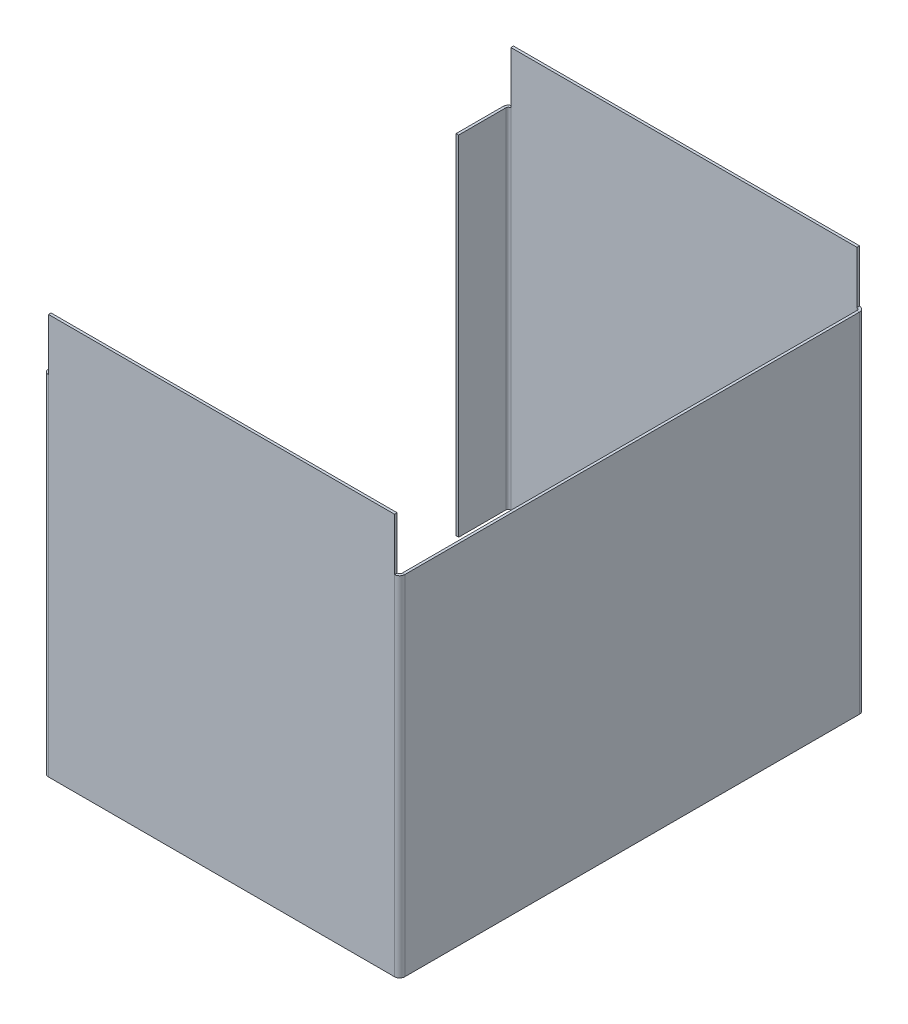
ISO-10303-21;
HEADER;
FILE_DESCRIPTION(('STEP AP214'),'2;1');
FILE_NAME('part.step','',(''),(''),'','','');
FILE_SCHEMA(('AUTOMOTIVE_DESIGN { 1 0 10303 214 1 1 1 1 }'));
ENDSEC;
DATA;
#1=APPLICATION_CONTEXT('core data for automotive mechanical design processes');
#2=APPLICATION_PROTOCOL_DEFINITION('international standard','automotive_design',2000,#1);
#3=PRODUCT_CONTEXT('',#1,'mechanical');
#4=PRODUCT('Part','Part','',(#3));
#5=PRODUCT_RELATED_PRODUCT_CATEGORY('part','',(#4));
#6=PRODUCT_DEFINITION_FORMATION('','',#4);
#7=PRODUCT_DEFINITION_CONTEXT('part definition',#1,'design');
#8=PRODUCT_DEFINITION('design','',#6,#7);
#9=PRODUCT_DEFINITION_SHAPE('','',#8);
#10=(LENGTH_UNIT() NAMED_UNIT(*) SI_UNIT(.MILLI.,.METRE.));
#11=(NAMED_UNIT(*) PLANE_ANGLE_UNIT() SI_UNIT($,.RADIAN.));
#12=(NAMED_UNIT(*) SI_UNIT($,.STERADIAN.) SOLID_ANGLE_UNIT());
#13=UNCERTAINTY_MEASURE_WITH_UNIT(LENGTH_MEASURE(1.E-05),#10,'distance_accuracy_value','');
#14=(GEOMETRIC_REPRESENTATION_CONTEXT(3) GLOBAL_UNCERTAINTY_ASSIGNED_CONTEXT((#13)) GLOBAL_UNIT_ASSIGNED_CONTEXT((#10,
#11,#12)) REPRESENTATION_CONTEXT('',''));
#15=CARTESIAN_POINT('',(0.,0.,0.));
#16=DIRECTION('',(0.,0.,1.));
#17=DIRECTION('',(1.,0.,0.));
#18=AXIS2_PLACEMENT_3D('',#15,#16,#17);
#19=CARTESIAN_POINT('',(0.,100.,-0.736600000000004));
#20=DIRECTION('',(0.,1.,0.));
#21=DIRECTION('',(0.,0.,1.));
#22=AXIS2_PLACEMENT_3D('',#19,#20,#21);
#23=PLANE('',#22);
#24=DIRECTION('',(1.,0.,0.));
#25=VECTOR('',#24,1.);
#26=CARTESIAN_POINT('',(0.,100.,-0.736600000000004));
#27=LINE('',#26,#25);
#28=CARTESIAN_POINT('',(0.,100.,-0.736600000000004));
#29=VERTEX_POINT('',#28);
#30=CARTESIAN_POINT('',(0.7366,100.,-0.736600000000004));
#31=VERTEX_POINT('',#30);
#32=EDGE_CURVE('E13',#29,#31,#27,.T.);
#33=ORIENTED_EDGE('',*,*,#32,.F.);
#34=CARTESIAN_POINT('',(-0.7366,100.,-0.736600000000002));
#35=DIRECTION('',(0.,-1.,0.));
#36=DIRECTION('',(0.,0.,-1.));
#37=AXIS2_PLACEMENT_3D('',#34,#35,#36);
#38=CIRCLE('',#37,0.7366);
#39=CARTESIAN_POINT('',(-0.7366,100.,0.));
#40=VERTEX_POINT('',#39);
#41=EDGE_CURVE('E154',#40,#29,#38,.F.);
#42=ORIENTED_EDGE('',*,*,#41,.F.);
#43=DIRECTION('',(0.,0.,-1.));
#44=VECTOR('',#43,1.);
#45=CARTESIAN_POINT('',(-0.7366,100.,0.736599999999998));
#46=LINE('',#45,#44);
#47=CARTESIAN_POINT('',(-0.7366,100.,0.736599999999998));
#48=VERTEX_POINT('',#47);
#49=EDGE_CURVE('E86',#48,#40,#46,.T.);
#50=ORIENTED_EDGE('',*,*,#49,.F.);
#51=CARTESIAN_POINT('',(-0.7366,100.,-0.736600000000002));
#52=DIRECTION('',(0.,1.,0.));
#53=DIRECTION('',(1.,0.,0.));
#54=AXIS2_PLACEMENT_3D('',#51,#52,#53);
#55=CIRCLE('',#54,1.4732);
#56=EDGE_CURVE('E151',#48,#31,#55,.T.);
#57=ORIENTED_EDGE('',*,*,#56,.T.);
#58=EDGE_LOOP('',(#33,#42,#50,#57));
#59=FACE_BOUND('',#58,.T.);
#60=ADVANCED_FACE('F78',(#59),#23,.T.);
#61=CARTESIAN_POINT('',(-0.7366,100.,0.736599999999998));
#62=DIRECTION('',(0.,1.,0.));
#63=DIRECTION('',(0.,0.,1.));
#64=AXIS2_PLACEMENT_3D('',#61,#62,#63);
#65=PLANE('',#64);
#66=DIRECTION('',(0.,0.,-1.));
#67=VECTOR('',#66,1.);
#68=CARTESIAN_POINT('',(0.,100.,-132.));
#69=LINE('',#68,#67);
#70=CARTESIAN_POINT('',(0.,100.,-131.2634));
#71=VERTEX_POINT('',#70);
#72=EDGE_CURVE('E319',#29,#71,#69,.T.);
#73=ORIENTED_EDGE('',*,*,#72,.F.);
#74=ORIENTED_EDGE('',*,*,#32,.T.);
#75=DIRECTION('',(0.,0.,-1.));
#76=VECTOR('',#75,1.);
#77=CARTESIAN_POINT('',(0.7366,100.,-132.));
#78=LINE('',#77,#76);
#79=CARTESIAN_POINT('',(0.7366,100.,-131.2634));
#80=VERTEX_POINT('',#79);
#81=EDGE_CURVE('E182',#31,#80,#78,.T.);
#82=ORIENTED_EDGE('',*,*,#81,.T.);
#83=DIRECTION('',(-1.,0.,0.));
#84=VECTOR('',#83,1.);
#85=CARTESIAN_POINT('',(0.7366,100.,-131.2634));
#86=LINE('',#85,#84);
#87=EDGE_CURVE('E94',#80,#71,#86,.T.);
#88=ORIENTED_EDGE('',*,*,#87,.T.);
#89=EDGE_LOOP('',(#73,#74,#82,#88));
#90=FACE_BOUND('',#89,.T.);
#91=ADVANCED_FACE('F399',(#90),#65,.T.);
#92=CARTESIAN_POINT('',(-0.7366,0.,0.));
#93=DIRECTION('',(0.,-1.,0.));
#94=DIRECTION('',(0.,0.,-1.));
#95=AXIS2_PLACEMENT_3D('',#92,#93,#94);
#96=PLANE('',#95);
#97=DIRECTION('',(0.,0.,1.));
#98=VECTOR('',#97,1.);
#99=CARTESIAN_POINT('',(-0.7366,0.,0.));
#100=LINE('',#99,#98);
#101=CARTESIAN_POINT('',(-0.7366,0.,0.));
#102=VERTEX_POINT('',#101);
#103=CARTESIAN_POINT('',(-0.7366,0.,0.736599999999998));
#104=VERTEX_POINT('',#103);
#105=EDGE_CURVE('E159',#102,#104,#100,.T.);
#106=ORIENTED_EDGE('',*,*,#105,.F.);
#107=CARTESIAN_POINT('',(-0.7366,0.,-0.736600000000002));
#108=DIRECTION('',(0.,-1.,0.));
#109=DIRECTION('',(0.,0.,-1.));
#110=AXIS2_PLACEMENT_3D('',#107,#108,#109);
#111=CIRCLE('',#110,0.7366);
#112=CARTESIAN_POINT('',(0.,0.,-0.736600000000004));
#113=VERTEX_POINT('',#112);
#114=EDGE_CURVE('E337',#102,#113,#111,.F.);
#115=ORIENTED_EDGE('',*,*,#114,.T.);
#116=DIRECTION('',(-1.,0.,0.));
#117=VECTOR('',#116,1.);
#118=CARTESIAN_POINT('',(0.7366,0.,-0.736600000000004));
#119=LINE('',#118,#117);
#120=CARTESIAN_POINT('',(0.7366,0.,-0.736600000000004));
#121=VERTEX_POINT('',#120);
#122=EDGE_CURVE('E372',#121,#113,#119,.T.);
#123=ORIENTED_EDGE('',*,*,#122,.F.);
#124=CARTESIAN_POINT('',(-0.7366,0.,-0.736600000000002));
#125=DIRECTION('',(0.,1.,0.));
#126=DIRECTION('',(1.,0.,0.));
#127=AXIS2_PLACEMENT_3D('',#124,#125,#126);
#128=CIRCLE('',#127,1.4732);
#129=EDGE_CURVE('E344',#104,#121,#128,.T.);
#130=ORIENTED_EDGE('',*,*,#129,.F.);
#131=EDGE_LOOP('',(#106,#115,#123,#130));
#132=FACE_BOUND('',#131,.T.);
#133=ADVANCED_FACE('F380',(#132),#96,.T.);
#134=CARTESIAN_POINT('',(0.7366,0.,-0.736600000000004));
#135=DIRECTION('',(0.,-1.,0.));
#136=DIRECTION('',(0.,0.,-1.));
#137=AXIS2_PLACEMENT_3D('',#134,#135,#136);
#138=PLANE('',#137);
#139=DIRECTION('',(1.,0.,0.));
#140=VECTOR('',#139,1.);
#141=CARTESIAN_POINT('',(0.,0.,0.));
#142=LINE('',#141,#140);
#143=CARTESIAN_POINT('',(-100.0634,0.,0.));
#144=VERTEX_POINT('',#143);
#145=EDGE_CURVE('E340',#144,#102,#142,.T.);
#146=ORIENTED_EDGE('',*,*,#145,.T.);
#147=ORIENTED_EDGE('',*,*,#105,.T.);
#148=DIRECTION('',(1.,0.,0.));
#149=VECTOR('',#148,1.);
#150=CARTESIAN_POINT('',(0.,0.,0.7366));
#151=LINE('',#150,#149);
#152=CARTESIAN_POINT('',(-100.0634,0.,0.736600000000011));
#153=VERTEX_POINT('',#152);
#154=EDGE_CURVE('E172',#153,#104,#151,.T.);
#155=ORIENTED_EDGE('',*,*,#154,.F.);
#156=DIRECTION('',(0.,0.,1.));
#157=VECTOR('',#156,1.);
#158=CARTESIAN_POINT('',(-100.0634,0.,0.));
#159=LINE('',#158,#157);
#160=EDGE_CURVE('E250',#144,#153,#159,.T.);
#161=ORIENTED_EDGE('',*,*,#160,.F.);
#162=EDGE_LOOP('',(#146,#147,#155,#161));
#163=FACE_BOUND('',#162,.T.);
#164=ADVANCED_FACE('F375',(#163),#138,.T.);
#165=CARTESIAN_POINT('',(-0.7366,100.,-132.));
#166=DIRECTION('',(0.,1.,0.));
#167=DIRECTION('',(0.,0.,1.));
#168=AXIS2_PLACEMENT_3D('',#165,#166,#167);
#169=PLANE('',#168);
#170=DIRECTION('',(0.,0.,-1.));
#171=VECTOR('',#170,1.);
#172=CARTESIAN_POINT('',(-0.7366,100.,-132.));
#173=LINE('',#172,#171);
#174=CARTESIAN_POINT('',(-0.7366,100.,-132.));
#175=VERTEX_POINT('',#174);
#176=CARTESIAN_POINT('',(-0.7366,100.,-132.7366));
#177=VERTEX_POINT('',#176);
#178=EDGE_CURVE('E369',#175,#177,#173,.T.);
#179=ORIENTED_EDGE('',*,*,#178,.F.);
#180=CARTESIAN_POINT('',(-0.7366,100.,-131.2634));
#181=DIRECTION('',(0.,-1.,0.));
#182=DIRECTION('',(0.,0.,-1.));
#183=AXIS2_PLACEMENT_3D('',#180,#181,#182);
#184=CIRCLE('',#183,0.7366);
#185=EDGE_CURVE('E316',#71,#175,#184,.F.);
#186=ORIENTED_EDGE('',*,*,#185,.F.);
#187=ORIENTED_EDGE('',*,*,#87,.F.);
#188=CARTESIAN_POINT('',(-0.7366,100.,-131.2634));
#189=DIRECTION('',(0.,1.,0.));
#190=DIRECTION('',(1.,0.,0.));
#191=AXIS2_PLACEMENT_3D('',#188,#189,#190);
#192=CIRCLE('',#191,1.4732);
#193=EDGE_CURVE('E325',#80,#177,#192,.T.);
#194=ORIENTED_EDGE('',*,*,#193,.T.);
#195=EDGE_LOOP('',(#179,#186,#187,#194));
#196=FACE_BOUND('',#195,.T.);
#197=ADVANCED_FACE('F409',(#196),#169,.T.);
#198=CARTESIAN_POINT('',(0.,0.,-131.2634));
#199=DIRECTION('',(0.,-1.,0.));
#200=DIRECTION('',(0.,0.,-1.));
#201=AXIS2_PLACEMENT_3D('',#198,#199,#200);
#202=PLANE('',#201);
#203=DIRECTION('',(1.,0.,0.));
#204=VECTOR('',#203,1.);
#205=CARTESIAN_POINT('',(0.,0.,-131.2634));
#206=LINE('',#205,#204);
#207=CARTESIAN_POINT('',(0.,0.,-131.2634));
#208=VERTEX_POINT('',#207);
#209=CARTESIAN_POINT('',(0.7366,0.,-131.2634));
#210=VERTEX_POINT('',#209);
#211=EDGE_CURVE('E123',#208,#210,#206,.T.);
#212=ORIENTED_EDGE('',*,*,#211,.F.);
#213=CARTESIAN_POINT('',(-0.7366,0.,-131.2634));
#214=DIRECTION('',(0.,-1.,0.));
#215=DIRECTION('',(0.,0.,-1.));
#216=AXIS2_PLACEMENT_3D('',#213,#214,#215);
#217=CIRCLE('',#216,0.7366);
#218=CARTESIAN_POINT('',(-0.7366,0.,-132.));
#219=VERTEX_POINT('',#218);
#220=EDGE_CURVE('E333',#208,#219,#217,.F.);
#221=ORIENTED_EDGE('',*,*,#220,.T.);
#222=DIRECTION('',(0.,0.,1.));
#223=VECTOR('',#222,1.);
#224=CARTESIAN_POINT('',(-0.7366,0.,-132.7366));
#225=LINE('',#224,#223);
#226=CARTESIAN_POINT('',(-0.7366,0.,-132.7366));
#227=VERTEX_POINT('',#226);
#228=EDGE_CURVE('E130',#227,#219,#225,.T.);
#229=ORIENTED_EDGE('',*,*,#228,.F.);
#230=CARTESIAN_POINT('',(-0.7366,0.,-131.2634));
#231=DIRECTION('',(0.,1.,0.));
#232=DIRECTION('',(1.,0.,0.));
#233=AXIS2_PLACEMENT_3D('',#230,#231,#232);
#234=CIRCLE('',#233,1.4732);
#235=EDGE_CURVE('E320',#210,#227,#234,.T.);
#236=ORIENTED_EDGE('',*,*,#235,.F.);
#237=EDGE_LOOP('',(#212,#221,#229,#236));
#238=FACE_BOUND('',#237,.T.);
#239=ADVANCED_FACE('F412',(#238),#202,.T.);
#240=CARTESIAN_POINT('',(-0.7366,0.,-132.7366));
#241=DIRECTION('',(0.,-1.,0.));
#242=DIRECTION('',(0.,0.,-1.));
#243=AXIS2_PLACEMENT_3D('',#240,#241,#242);
#244=PLANE('',#243);
#245=DIRECTION('',(0.,0.,-1.));
#246=VECTOR('',#245,1.);
#247=CARTESIAN_POINT('',(0.,0.,-132.));
#248=LINE('',#247,#246);
#249=EDGE_CURVE('E335',#113,#208,#248,.T.);
#250=ORIENTED_EDGE('',*,*,#249,.T.);
#251=ORIENTED_EDGE('',*,*,#211,.T.);
#252=DIRECTION('',(0.,0.,-1.));
#253=VECTOR('',#252,1.);
#254=CARTESIAN_POINT('',(0.7366,0.,-132.));
#255=LINE('',#254,#253);
#256=EDGE_CURVE('E346',#121,#210,#255,.T.);
#257=ORIENTED_EDGE('',*,*,#256,.F.);
#258=ORIENTED_EDGE('',*,*,#122,.T.);
#259=EDGE_LOOP('',(#250,#251,#257,#258));
#260=FACE_BOUND('',#259,.T.);
#261=ADVANCED_FACE('F394',(#260),#244,.T.);
#262=CARTESIAN_POINT('',(0.,100.,-132.7366));
#263=DIRECTION('',(0.,0.,1.));
#264=DIRECTION('',(1.,0.,0.));
#265=AXIS2_PLACEMENT_3D('',#262,#263,#264);
#266=PLANE('',#265);
#267=DIRECTION('',(1.,0.,0.));
#268=VECTOR('',#267,1.);
#269=CARTESIAN_POINT('',(0.,0.,-132.7366));
#270=LINE('',#269,#268);
#271=CARTESIAN_POINT('',(-100.0634,0.,-132.7366));
#272=VERTEX_POINT('',#271);
#273=EDGE_CURVE('E313',#227,#272,#270,.F.);
#274=ORIENTED_EDGE('',*,*,#273,.T.);
#275=DIRECTION('',(0.,-1.,0.));
#276=VECTOR('',#275,1.);
#277=CARTESIAN_POINT('',(-100.0634,0.,-132.7366));
#278=LINE('',#277,#276);
#279=CARTESIAN_POINT('',(-100.0634,100.,-132.7366));
#280=VERTEX_POINT('',#279);
#281=EDGE_CURVE('E292',#272,#280,#278,.F.);
#282=ORIENTED_EDGE('',*,*,#281,.T.);
#283=DIRECTION('',(0.,-1.,0.));
#284=VECTOR('',#283,1.);
#285=CARTESIAN_POINT('',(-100.0634,115.,-132.7366));
#286=LINE('',#285,#284);
#287=CARTESIAN_POINT('',(-100.0634,115.,-132.7366));
#288=VERTEX_POINT('',#287);
#289=EDGE_CURVE('E645',#288,#280,#286,.T.);
#290=ORIENTED_EDGE('',*,*,#289,.F.);
#291=DIRECTION('',(-1.,0.,0.));
#292=VECTOR('',#291,1.);
#293=CARTESIAN_POINT('',(-0.7366,115.,-132.7366));
#294=LINE('',#293,#292);
#295=CARTESIAN_POINT('',(-0.7366,115.,-132.7366));
#296=VERTEX_POINT('',#295);
#297=EDGE_CURVE('E558',#296,#288,#294,.T.);
#298=ORIENTED_EDGE('',*,*,#297,.F.);
#299=DIRECTION('',(0.,-1.,0.));
#300=VECTOR('',#299,1.);
#301=CARTESIAN_POINT('',(-0.7366,115.,-132.7366));
#302=LINE('',#301,#300);
#303=EDGE_CURVE('E576',#296,#177,#302,.T.);
#304=ORIENTED_EDGE('',*,*,#303,.T.);
#305=DIRECTION('',(0.,-1.,0.));
#306=VECTOR('',#305,1.);
#307=CARTESIAN_POINT('',(-0.7366,100.,-132.7366));
#308=LINE('',#307,#306);
#309=EDGE_CURVE('E327',#177,#227,#308,.T.);
#310=ORIENTED_EDGE('',*,*,#309,.T.);
#311=EDGE_LOOP('',(#274,#282,#290,#298,#304,#310));
#312=FACE_BOUND('',#311,.T.);
#313=ADVANCED_FACE('F417',(#312),#266,.F.);
#314=CARTESIAN_POINT('',(0.,100.,-132.));
#315=DIRECTION('',(0.,0.,1.));
#316=DIRECTION('',(1.,0.,0.));
#317=AXIS2_PLACEMENT_3D('',#314,#315,#316);
#318=PLANE('',#317);
#319=DIRECTION('',(-1.,0.,0.));
#320=VECTOR('',#319,1.);
#321=CARTESIAN_POINT('',(0.,0.,-132.));
#322=LINE('',#321,#320);
#323=CARTESIAN_POINT('',(-100.0634,0.,-132.));
#324=VERTEX_POINT('',#323);
#325=EDGE_CURVE('E330',#219,#324,#322,.T.);
#326=ORIENTED_EDGE('',*,*,#325,.F.);
#327=DIRECTION('',(0.,-1.,0.));
#328=VECTOR('',#327,1.);
#329=CARTESIAN_POINT('',(-0.7366,100.,-132.));
#330=LINE('',#329,#328);
#331=EDGE_CURVE('E363',#175,#219,#330,.T.);
#332=ORIENTED_EDGE('',*,*,#331,.F.);
#333=DIRECTION('',(0.,-1.,0.));
#334=VECTOR('',#333,1.);
#335=CARTESIAN_POINT('',(-0.7366,115.,-132.));
#336=LINE('',#335,#334);
#337=CARTESIAN_POINT('',(-0.7366,115.,-132.));
#338=VERTEX_POINT('',#337);
#339=EDGE_CURVE('E570',#338,#175,#336,.T.);
#340=ORIENTED_EDGE('',*,*,#339,.F.);
#341=DIRECTION('',(1.,0.,0.));
#342=VECTOR('',#341,1.);
#343=CARTESIAN_POINT('',(-100.0634,115.,-132.));
#344=LINE('',#343,#342);
#345=CARTESIAN_POINT('',(-100.0634,115.,-132.));
#346=VERTEX_POINT('',#345);
#347=EDGE_CURVE('E554',#346,#338,#344,.T.);
#348=ORIENTED_EDGE('',*,*,#347,.F.);
#349=DIRECTION('',(0.,-1.,0.));
#350=VECTOR('',#349,1.);
#351=CARTESIAN_POINT('',(-100.0634,115.,-132.));
#352=LINE('',#351,#350);
#353=CARTESIAN_POINT('',(-100.0634,100.,-132.));
#354=VERTEX_POINT('',#353);
#355=EDGE_CURVE('E566',#346,#354,#352,.T.);
#356=ORIENTED_EDGE('',*,*,#355,.T.);
#357=DIRECTION('',(0.,-1.,0.));
#358=VECTOR('',#357,1.);
#359=CARTESIAN_POINT('',(-100.0634,0.,-132.));
#360=LINE('',#359,#358);
#361=EDGE_CURVE('E305',#324,#354,#360,.F.);
#362=ORIENTED_EDGE('',*,*,#361,.F.);
#363=EDGE_LOOP('',(#326,#332,#340,#348,#356,#362));
#364=FACE_BOUND('',#363,.T.);
#365=ADVANCED_FACE('F420',(#364),#318,.T.);
#366=CARTESIAN_POINT('',(-0.7366,100.,-131.2634));
#367=DIRECTION('',(0.,-1.,0.));
#368=DIRECTION('',(0.,0.,-1.));
#369=AXIS2_PLACEMENT_3D('',#366,#367,#368);
#370=CYLINDRICAL_SURFACE('',#369,0.7366);
#371=ORIENTED_EDGE('',*,*,#220,.F.);
#372=DIRECTION('',(0.,-1.,0.));
#373=VECTOR('',#372,1.);
#374=CARTESIAN_POINT('',(0.,100.,-131.2634));
#375=LINE('',#374,#373);
#376=EDGE_CURVE('E360',#71,#208,#375,.T.);
#377=ORIENTED_EDGE('',*,*,#376,.F.);
#378=ORIENTED_EDGE('',*,*,#185,.T.);
#379=ORIENTED_EDGE('',*,*,#331,.T.);
#380=EDGE_LOOP('',(#371,#377,#378,#379));
#381=FACE_BOUND('',#380,.T.);
#382=ADVANCED_FACE('F424',(#381),#370,.F.);
#383=CARTESIAN_POINT('',(0.,100.,-132.));
#384=DIRECTION('',(-1.,0.,0.));
#385=DIRECTION('',(0.,0.,1.));
#386=AXIS2_PLACEMENT_3D('',#383,#384,#385);
#387=PLANE('',#386);
#388=ORIENTED_EDGE('',*,*,#249,.F.);
#389=DIRECTION('',(0.,-1.,0.));
#390=VECTOR('',#389,1.);
#391=CARTESIAN_POINT('',(0.,100.,-0.736600000000004));
#392=LINE('',#391,#390);
#393=EDGE_CURVE('E357',#29,#113,#392,.T.);
#394=ORIENTED_EDGE('',*,*,#393,.F.);
#395=ORIENTED_EDGE('',*,*,#72,.T.);
#396=ORIENTED_EDGE('',*,*,#376,.T.);
#397=EDGE_LOOP('',(#388,#394,#395,#396));
#398=FACE_BOUND('',#397,.T.);
#399=ADVANCED_FACE('F392',(#398),#387,.T.);
#400=CARTESIAN_POINT('',(-0.7366,100.,-0.736600000000002));
#401=DIRECTION('',(0.,-1.,0.));
#402=DIRECTION('',(0.,0.,-1.));
#403=AXIS2_PLACEMENT_3D('',#400,#401,#402);
#404=CYLINDRICAL_SURFACE('',#403,0.7366);
#405=ORIENTED_EDGE('',*,*,#114,.F.);
#406=DIRECTION('',(0.,-1.,0.));
#407=VECTOR('',#406,1.);
#408=CARTESIAN_POINT('',(-0.7366,100.,0.));
#409=LINE('',#408,#407);
#410=EDGE_CURVE('E176',#40,#102,#409,.T.);
#411=ORIENTED_EDGE('',*,*,#410,.F.);
#412=ORIENTED_EDGE('',*,*,#41,.T.);
#413=ORIENTED_EDGE('',*,*,#393,.T.);
#414=EDGE_LOOP('',(#405,#411,#412,#413));
#415=FACE_BOUND('',#414,.T.);
#416=ADVANCED_FACE('F388',(#415),#404,.F.);
#417=CARTESIAN_POINT('',(0.,100.,0.));
#418=DIRECTION('',(0.,0.,-1.));
#419=DIRECTION('',(-1.,0.,0.));
#420=AXIS2_PLACEMENT_3D('',#417,#418,#419);
#421=PLANE('',#420);
#422=ORIENTED_EDGE('',*,*,#145,.F.);
#423=DIRECTION('',(0.,1.,0.));
#424=VECTOR('',#423,1.);
#425=CARTESIAN_POINT('',(-100.0634,100.,0.));
#426=LINE('',#425,#424);
#427=CARTESIAN_POINT('',(-100.0634,100.,0.));
#428=VERTEX_POINT('',#427);
#429=EDGE_CURVE('E245',#428,#144,#426,.F.);
#430=ORIENTED_EDGE('',*,*,#429,.F.);
#431=DIRECTION('',(0.,-1.,0.));
#432=VECTOR('',#431,1.);
#433=CARTESIAN_POINT('',(-100.0634,115.,0.));
#434=LINE('',#433,#432);
#435=CARTESIAN_POINT('',(-100.0634,115.,0.));
#436=VERTEX_POINT('',#435);
#437=EDGE_CURVE('E193',#436,#428,#434,.T.);
#438=ORIENTED_EDGE('',*,*,#437,.F.);
#439=DIRECTION('',(-1.,0.,0.));
#440=VECTOR('',#439,1.);
#441=CARTESIAN_POINT('',(-0.7366,115.,0.));
#442=LINE('',#441,#440);
#443=CARTESIAN_POINT('',(-0.7366,115.,0.));
#444=VERTEX_POINT('',#443);
#445=EDGE_CURVE('E583',#444,#436,#442,.T.);
#446=ORIENTED_EDGE('',*,*,#445,.F.);
#447=DIRECTION('',(0.,-1.,0.));
#448=VECTOR('',#447,1.);
#449=CARTESIAN_POINT('',(-0.7366,115.,0.));
#450=LINE('',#449,#448);
#451=EDGE_CURVE('E188',#444,#40,#450,.T.);
#452=ORIENTED_EDGE('',*,*,#451,.T.);
#453=ORIENTED_EDGE('',*,*,#410,.T.);
#454=EDGE_LOOP('',(#422,#430,#438,#446,#452,#453));
#455=FACE_BOUND('',#454,.T.);
#456=ADVANCED_FACE('F383',(#455),#421,.T.);
#457=CARTESIAN_POINT('',(0.,100.,0.7366));
#458=DIRECTION('',(0.,0.,-1.));
#459=DIRECTION('',(-1.,0.,0.));
#460=AXIS2_PLACEMENT_3D('',#457,#458,#459);
#461=PLANE('',#460);
#462=ORIENTED_EDGE('',*,*,#154,.T.);
#463=DIRECTION('',(0.,-1.,0.));
#464=VECTOR('',#463,1.);
#465=CARTESIAN_POINT('',(-0.7366,100.,0.736599999999998));
#466=LINE('',#465,#464);
#467=EDGE_CURVE('E164',#48,#104,#466,.T.);
#468=ORIENTED_EDGE('',*,*,#467,.F.);
#469=DIRECTION('',(0.,-1.,0.));
#470=VECTOR('',#469,1.);
#471=CARTESIAN_POINT('',(-0.7366,115.,0.736599999999998));
#472=LINE('',#471,#470);
#473=CARTESIAN_POINT('',(-0.7366,115.,0.736599999999998));
#474=VERTEX_POINT('',#473);
#475=EDGE_CURVE('E168',#474,#48,#472,.T.);
#476=ORIENTED_EDGE('',*,*,#475,.F.);
#477=DIRECTION('',(1.,0.,0.));
#478=VECTOR('',#477,1.);
#479=CARTESIAN_POINT('',(-100.0634,115.,0.736600000000011));
#480=LINE('',#479,#478);
#481=CARTESIAN_POINT('',(-100.0634,115.,0.736600000000011));
#482=VERTEX_POINT('',#481);
#483=EDGE_CURVE('E573',#482,#474,#480,.T.);
#484=ORIENTED_EDGE('',*,*,#483,.F.);
#485=DIRECTION('',(0.,-1.,0.));
#486=VECTOR('',#485,1.);
#487=CARTESIAN_POINT('',(-100.0634,115.,0.736600000000011));
#488=LINE('',#487,#486);
#489=CARTESIAN_POINT('',(-100.0634,100.,0.736600000000011));
#490=VERTEX_POINT('',#489);
#491=EDGE_CURVE('E187',#482,#490,#488,.T.);
#492=ORIENTED_EDGE('',*,*,#491,.T.);
#493=DIRECTION('',(0.,1.,0.));
#494=VECTOR('',#493,1.);
#495=CARTESIAN_POINT('',(-100.0634,100.,0.736600000000011));
#496=LINE('',#495,#494);
#497=EDGE_CURVE('E233',#490,#153,#496,.F.);
#498=ORIENTED_EDGE('',*,*,#497,.T.);
#499=EDGE_LOOP('',(#462,#468,#476,#484,#492,#498));
#500=FACE_BOUND('',#499,.T.);
#501=ADVANCED_FACE('F165',(#500),#461,.F.);
#502=CARTESIAN_POINT('',(-0.7366,100.,-0.736600000000002));
#503=DIRECTION('',(0.,-1.,0.));
#504=DIRECTION('',(0.,0.,-1.));
#505=AXIS2_PLACEMENT_3D('',#502,#503,#504);
#506=CYLINDRICAL_SURFACE('',#505,1.4732);
#507=ORIENTED_EDGE('',*,*,#129,.T.);
#508=DIRECTION('',(0.,-1.,0.));
#509=VECTOR('',#508,1.);
#510=CARTESIAN_POINT('',(0.7366,100.,-0.736600000000004));
#511=LINE('',#510,#509);
#512=EDGE_CURVE('E177',#31,#121,#511,.T.);
#513=ORIENTED_EDGE('',*,*,#512,.F.);
#514=ORIENTED_EDGE('',*,*,#56,.F.);
#515=ORIENTED_EDGE('',*,*,#467,.T.);
#516=EDGE_LOOP('',(#507,#513,#514,#515));
#517=FACE_BOUND('',#516,.T.);
#518=ADVANCED_FACE('F179',(#517),#506,.T.);
#519=CARTESIAN_POINT('',(0.7366,100.,-132.));
#520=DIRECTION('',(-1.,0.,0.));
#521=DIRECTION('',(0.,0.,1.));
#522=AXIS2_PLACEMENT_3D('',#519,#520,#521);
#523=PLANE('',#522);
#524=ORIENTED_EDGE('',*,*,#256,.T.);
#525=DIRECTION('',(0.,-1.,0.));
#526=VECTOR('',#525,1.);
#527=CARTESIAN_POINT('',(0.7366,100.,-131.2634));
#528=LINE('',#527,#526);
#529=EDGE_CURVE('E351',#80,#210,#528,.T.);
#530=ORIENTED_EDGE('',*,*,#529,.F.);
#531=ORIENTED_EDGE('',*,*,#81,.F.);
#532=ORIENTED_EDGE('',*,*,#512,.T.);
#533=EDGE_LOOP('',(#524,#530,#531,#532));
#534=FACE_BOUND('',#533,.T.);
#535=ADVANCED_FACE('F396',(#534),#523,.F.);
#536=CARTESIAN_POINT('',(-0.7366,100.,-131.2634));
#537=DIRECTION('',(0.,-1.,0.));
#538=DIRECTION('',(0.,0.,-1.));
#539=AXIS2_PLACEMENT_3D('',#536,#537,#538);
#540=CYLINDRICAL_SURFACE('',#539,1.4732);
#541=ORIENTED_EDGE('',*,*,#235,.T.);
#542=ORIENTED_EDGE('',*,*,#309,.F.);
#543=ORIENTED_EDGE('',*,*,#193,.F.);
#544=ORIENTED_EDGE('',*,*,#529,.T.);
#545=EDGE_LOOP('',(#541,#542,#543,#544));
#546=FACE_BOUND('',#545,.T.);
#547=ADVANCED_FACE('F441',(#546),#540,.T.);
#548=CARTESIAN_POINT('',(-0.7366,0.,-131.2634));
#549=DIRECTION('',(0.,-1.,0.));
#550=DIRECTION('',(-1.,0.,0.));
#551=AXIS2_PLACEMENT_3D('',#548,#549,#550);
#552=PLANE('',#551);
#553=ORIENTED_EDGE('',*,*,#273,.F.);
#554=ORIENTED_EDGE('',*,*,#228,.T.);
#555=ORIENTED_EDGE('',*,*,#325,.T.);
#556=DIRECTION('',(0.,0.,-1.));
#557=VECTOR('',#556,1.);
#558=CARTESIAN_POINT('',(-100.0634,0.,-132.));
#559=LINE('',#558,#557);
#560=EDGE_CURVE('E299',#324,#272,#559,.T.);
#561=ORIENTED_EDGE('',*,*,#560,.T.);
#562=EDGE_LOOP('',(#553,#554,#555,#561));
#563=FACE_BOUND('',#562,.T.);
#564=ADVANCED_FACE('F444',(#563),#552,.T.);
#565=CARTESIAN_POINT('',(-100.0634,100.,-131.2634));
#566=DIRECTION('',(0.,1.,0.));
#567=DIRECTION('',(0.,0.,1.));
#568=AXIS2_PLACEMENT_3D('',#565,#566,#567);
#569=PLANE('',#568);
#570=DIRECTION('',(1.,0.,0.));
#571=VECTOR('',#570,1.);
#572=CARTESIAN_POINT('',(-101.5366,100.,-131.2634));
#573=LINE('',#572,#571);
#574=CARTESIAN_POINT('',(-100.8,100.,-131.2634));
#575=VERTEX_POINT('',#574);
#576=CARTESIAN_POINT('',(-101.5366,100.,-131.2634));
#577=VERTEX_POINT('',#576);
#578=EDGE_CURVE('E253',#575,#577,#573,.F.);
#579=ORIENTED_EDGE('',*,*,#578,.F.);
#580=CARTESIAN_POINT('',(-100.0634,100.,-131.2634));
#581=DIRECTION('',(0.,-1.,0.));
#582=DIRECTION('',(0.,0.,-1.));
#583=AXIS2_PLACEMENT_3D('',#580,#581,#582);
#584=CIRCLE('',#583,0.736600000000004);
#585=EDGE_CURVE('E302',#354,#575,#584,.F.);
#586=ORIENTED_EDGE('',*,*,#585,.F.);
#587=DIRECTION('',(0.,0.,-1.));
#588=VECTOR('',#587,1.);
#589=CARTESIAN_POINT('',(-100.0634,100.,-132.));
#590=LINE('',#589,#588);
#591=EDGE_CURVE('E310',#354,#280,#590,.T.);
#592=ORIENTED_EDGE('',*,*,#591,.T.);
#593=CARTESIAN_POINT('',(-100.0634,100.,-131.2634));
#594=DIRECTION('',(0.,-1.,0.));
#595=DIRECTION('',(0.,0.,-1.));
#596=AXIS2_PLACEMENT_3D('',#593,#594,#595);
#597=CIRCLE('',#596,1.4732);
#598=EDGE_CURVE('E295',#280,#577,#597,.F.);
#599=ORIENTED_EDGE('',*,*,#598,.T.);
#600=EDGE_LOOP('',(#579,#586,#592,#599));
#601=FACE_BOUND('',#600,.T.);
#602=ADVANCED_FACE('F448',(#601),#569,.T.);
#603=CARTESIAN_POINT('',(-100.0634,0.,-131.2634));
#604=DIRECTION('',(0.,1.,0.));
#605=DIRECTION('',(0.,0.,1.));
#606=AXIS2_PLACEMENT_3D('',#603,#604,#605);
#607=PLANE('',#606);
#608=CARTESIAN_POINT('',(-100.0634,0.,-131.2634));
#609=DIRECTION('',(0.,-1.,0.));
#610=DIRECTION('',(0.,0.,-1.));
#611=AXIS2_PLACEMENT_3D('',#608,#609,#610);
#612=CIRCLE('',#611,0.736600000000004);
#613=CARTESIAN_POINT('',(-100.8,0.,-131.2634));
#614=VERTEX_POINT('',#613);
#615=EDGE_CURVE('E259',#614,#324,#612,.T.);
#616=ORIENTED_EDGE('',*,*,#615,.F.);
#617=DIRECTION('',(1.,0.,0.));
#618=VECTOR('',#617,1.);
#619=CARTESIAN_POINT('',(-100.8,0.,-131.2634));
#620=LINE('',#619,#618);
#621=CARTESIAN_POINT('',(-101.5366,0.,-131.2634));
#622=VERTEX_POINT('',#621);
#623=EDGE_CURVE('E284',#614,#622,#620,.F.);
#624=ORIENTED_EDGE('',*,*,#623,.T.);
#625=CARTESIAN_POINT('',(-100.0634,0.,-131.2634));
#626=DIRECTION('',(0.,-1.,0.));
#627=DIRECTION('',(0.,0.,-1.));
#628=AXIS2_PLACEMENT_3D('',#625,#626,#627);
#629=CIRCLE('',#628,1.4732);
#630=EDGE_CURVE('E296',#622,#272,#629,.T.);
#631=ORIENTED_EDGE('',*,*,#630,.T.);
#632=ORIENTED_EDGE('',*,*,#560,.F.);
#633=EDGE_LOOP('',(#616,#624,#631,#632));
#634=FACE_BOUND('',#633,.T.);
#635=ADVANCED_FACE('F450',(#634),#607,.F.);
#636=CARTESIAN_POINT('',(-100.0634,0.,-131.2634));
#637=DIRECTION('',(0.,-1.,0.));
#638=DIRECTION('',(-1.,0.,0.));
#639=AXIS2_PLACEMENT_3D('',#636,#637,#638);
#640=CYLINDRICAL_SURFACE('',#639,1.4732);
#641=ORIENTED_EDGE('',*,*,#281,.F.);
#642=ORIENTED_EDGE('',*,*,#630,.F.);
#643=DIRECTION('',(0.,-1.,0.));
#644=VECTOR('',#643,1.);
#645=CARTESIAN_POINT('',(-101.5366,100.,-131.2634));
#646=LINE('',#645,#644);
#647=EDGE_CURVE('E281',#622,#577,#646,.F.);
#648=ORIENTED_EDGE('',*,*,#647,.T.);
#649=ORIENTED_EDGE('',*,*,#598,.F.);
#650=EDGE_LOOP('',(#641,#642,#648,#649));
#651=FACE_BOUND('',#650,.T.);
#652=ADVANCED_FACE('F453',(#651),#640,.T.);
#653=CARTESIAN_POINT('',(-100.0634,0.,-131.2634));
#654=DIRECTION('',(0.,-1.,0.));
#655=DIRECTION('',(-1.,0.,0.));
#656=AXIS2_PLACEMENT_3D('',#653,#654,#655);
#657=CYLINDRICAL_SURFACE('',#656,0.736600000000004);
#658=ORIENTED_EDGE('',*,*,#361,.T.);
#659=ORIENTED_EDGE('',*,*,#585,.T.);
#660=DIRECTION('',(0.,-1.,0.));
#661=VECTOR('',#660,1.);
#662=CARTESIAN_POINT('',(-100.8,100.,-131.2634));
#663=LINE('',#662,#661);
#664=EDGE_CURVE('E287',#575,#614,#663,.T.);
#665=ORIENTED_EDGE('',*,*,#664,.T.);
#666=ORIENTED_EDGE('',*,*,#615,.T.);
#667=EDGE_LOOP('',(#658,#659,#665,#666));
#668=FACE_BOUND('',#667,.T.);
#669=ADVANCED_FACE('F458',(#668),#657,.F.);
#670=CARTESIAN_POINT('',(-101.5366,100.,-132.));
#671=DIRECTION('',(0.,-1.,0.));
#672=DIRECTION('',(0.,0.,-1.));
#673=AXIS2_PLACEMENT_3D('',#670,#671,#672);
#674=PLANE('',#673);
#675=ORIENTED_EDGE('',*,*,#578,.T.);
#676=DIRECTION('',(0.,0.,-1.));
#677=VECTOR('',#676,1.);
#678=CARTESIAN_POINT('',(-101.536600000001,100.,-3.91757792253608E-13));
#679=LINE('',#678,#677);
#680=CARTESIAN_POINT('',(-101.5366,100.,-117.7366));
#681=VERTEX_POINT('',#680);
#682=EDGE_CURVE('E269',#681,#577,#679,.T.);
#683=ORIENTED_EDGE('',*,*,#682,.F.);
#684=DIRECTION('',(1.,0.,0.));
#685=VECTOR('',#684,1.);
#686=CARTESIAN_POINT('',(-101.5366,100.,-117.7366));
#687=LINE('',#686,#685);
#688=CARTESIAN_POINT('',(-100.8,100.,-117.7366));
#689=VERTEX_POINT('',#688);
#690=EDGE_CURVE('E260',#681,#689,#687,.T.);
#691=ORIENTED_EDGE('',*,*,#690,.T.);
#692=DIRECTION('',(0.,0.,1.));
#693=VECTOR('',#692,1.);
#694=CARTESIAN_POINT('',(-100.8,100.,-132.));
#695=LINE('',#694,#693);
#696=EDGE_CURVE('E278',#689,#575,#695,.F.);
#697=ORIENTED_EDGE('',*,*,#696,.T.);
#698=EDGE_LOOP('',(#675,#683,#691,#697));
#699=FACE_BOUND('',#698,.T.);
#700=ADVANCED_FACE('F461',(#699),#674,.F.);
#701=CARTESIAN_POINT('',(-101.5366,0.,-117.7366));
#702=DIRECTION('',(0.,1.,0.));
#703=DIRECTION('',(0.,0.,1.));
#704=AXIS2_PLACEMENT_3D('',#701,#702,#703);
#705=PLANE('',#704);
#706=ORIENTED_EDGE('',*,*,#623,.F.);
#707=DIRECTION('',(0.,0.,-1.));
#708=VECTOR('',#707,1.);
#709=CARTESIAN_POINT('',(-100.8,0.,-117.7366));
#710=LINE('',#709,#708);
#711=CARTESIAN_POINT('',(-100.8,0.,-117.7366));
#712=VERTEX_POINT('',#711);
#713=EDGE_CURVE('E275',#614,#712,#710,.F.);
#714=ORIENTED_EDGE('',*,*,#713,.T.);
#715=DIRECTION('',(1.,0.,0.));
#716=VECTOR('',#715,1.);
#717=CARTESIAN_POINT('',(-101.5366,0.,-117.7366));
#718=LINE('',#717,#716);
#719=CARTESIAN_POINT('',(-101.5366,0.,-117.7366));
#720=VERTEX_POINT('',#719);
#721=EDGE_CURVE('E256',#720,#712,#718,.T.);
#722=ORIENTED_EDGE('',*,*,#721,.F.);
#723=DIRECTION('',(0.,0.,1.));
#724=VECTOR('',#723,1.);
#725=CARTESIAN_POINT('',(-101.536600000001,0.,-3.91757792253608E-13));
#726=LINE('',#725,#724);
#727=EDGE_CURVE('E266',#622,#720,#726,.T.);
#728=ORIENTED_EDGE('',*,*,#727,.F.);
#729=EDGE_LOOP('',(#706,#714,#722,#728));
#730=FACE_BOUND('',#729,.T.);
#731=ADVANCED_FACE('F468',(#730),#705,.F.);
#732=CARTESIAN_POINT('',(-101.536600000001,0.,-3.91757792253608E-13));
#733=DIRECTION('',(1.,0.,0.));
#734=DIRECTION('',(0.,0.,-1.));
#735=AXIS2_PLACEMENT_3D('',#732,#733,#734);
#736=PLANE('',#735);
#737=ORIENTED_EDGE('',*,*,#647,.F.);
#738=ORIENTED_EDGE('',*,*,#727,.T.);
#739=DIRECTION('',(0.,1.,0.));
#740=VECTOR('',#739,1.);
#741=CARTESIAN_POINT('',(-101.5366,0.,-117.7366));
#742=LINE('',#741,#740);
#743=EDGE_CURVE('E263',#720,#681,#742,.T.);
#744=ORIENTED_EDGE('',*,*,#743,.T.);
#745=ORIENTED_EDGE('',*,*,#682,.T.);
#746=EDGE_LOOP('',(#737,#738,#744,#745));
#747=FACE_BOUND('',#746,.T.);
#748=ADVANCED_FACE('F472',(#747),#736,.F.);
#749=CARTESIAN_POINT('',(-100.800000000001,0.,-3.89185967099416E-13));
#750=DIRECTION('',(1.,0.,0.));
#751=DIRECTION('',(0.,0.,-1.));
#752=AXIS2_PLACEMENT_3D('',#749,#750,#751);
#753=PLANE('',#752);
#754=ORIENTED_EDGE('',*,*,#713,.F.);
#755=ORIENTED_EDGE('',*,*,#664,.F.);
#756=ORIENTED_EDGE('',*,*,#696,.F.);
#757=DIRECTION('',(0.,-1.,0.));
#758=VECTOR('',#757,1.);
#759=CARTESIAN_POINT('',(-100.8,100.,-117.7366));
#760=LINE('',#759,#758);
#761=EDGE_CURVE('E272',#712,#689,#760,.F.);
#762=ORIENTED_EDGE('',*,*,#761,.F.);
#763=EDGE_LOOP('',(#754,#755,#756,#762));
#764=FACE_BOUND('',#763,.T.);
#765=ADVANCED_FACE('F478',(#764),#753,.T.);
#766=CARTESIAN_POINT('',(-101.5366,100.,-117.7366));
#767=DIRECTION('',(0.,0.,-1.));
#768=DIRECTION('',(-1.,0.,0.));
#769=AXIS2_PLACEMENT_3D('',#766,#767,#768);
#770=PLANE('',#769);
#771=ORIENTED_EDGE('',*,*,#761,.T.);
#772=ORIENTED_EDGE('',*,*,#690,.F.);
#773=ORIENTED_EDGE('',*,*,#743,.F.);
#774=ORIENTED_EDGE('',*,*,#721,.T.);
#775=EDGE_LOOP('',(#771,#772,#773,#774));
#776=FACE_BOUND('',#775,.T.);
#777=ADVANCED_FACE('F474',(#776),#770,.F.);
#778=CARTESIAN_POINT('',(-100.0634,0.,-0.736599999999993));
#779=DIRECTION('',(0.,-1.,0.));
#780=DIRECTION('',(0.,0.,-1.));
#781=AXIS2_PLACEMENT_3D('',#778,#779,#780);
#782=PLANE('',#781);
#783=DIRECTION('',(1.,0.,0.));
#784=VECTOR('',#783,1.);
#785=CARTESIAN_POINT('',(-101.5366,0.,-0.736599999999987));
#786=LINE('',#785,#784);
#787=CARTESIAN_POINT('',(-100.8,0.,-0.73659999999999));
#788=VERTEX_POINT('',#787);
#789=CARTESIAN_POINT('',(-101.5366,0.,-0.736599999999987));
#790=VERTEX_POINT('',#789);
#791=EDGE_CURVE('E191',#788,#790,#786,.F.);
#792=ORIENTED_EDGE('',*,*,#791,.F.);
#793=CARTESIAN_POINT('',(-100.0634,0.,-0.736599999999993));
#794=DIRECTION('',(0.,1.,0.));
#795=DIRECTION('',(0.,0.,1.));
#796=AXIS2_PLACEMENT_3D('',#793,#794,#795);
#797=CIRCLE('',#796,0.736600000000004);
#798=EDGE_CURVE('E242',#144,#788,#797,.F.);
#799=ORIENTED_EDGE('',*,*,#798,.F.);
#800=ORIENTED_EDGE('',*,*,#160,.T.);
#801=CARTESIAN_POINT('',(-100.0634,0.,-0.736599999999993));
#802=DIRECTION('',(0.,1.,0.));
#803=DIRECTION('',(0.,0.,1.));
#804=AXIS2_PLACEMENT_3D('',#801,#802,#803);
#805=CIRCLE('',#804,1.4732);
#806=EDGE_CURVE('E235',#153,#790,#805,.F.);
#807=ORIENTED_EDGE('',*,*,#806,.T.);
#808=EDGE_LOOP('',(#792,#799,#800,#807));
#809=FACE_BOUND('',#808,.T.);
#810=ADVANCED_FACE('F477',(#809),#782,.T.);
#811=CARTESIAN_POINT('',(-100.0634,100.,-0.736599999999993));
#812=DIRECTION('',(0.,-1.,0.));
#813=DIRECTION('',(0.,0.,-1.));
#814=AXIS2_PLACEMENT_3D('',#811,#812,#813);
#815=PLANE('',#814);
#816=CARTESIAN_POINT('',(-100.0634,100.,-0.736599999999993));
#817=DIRECTION('',(0.,1.,0.));
#818=DIRECTION('',(0.,0.,1.));
#819=AXIS2_PLACEMENT_3D('',#816,#817,#818);
#820=CIRCLE('',#819,0.736600000000004);
#821=CARTESIAN_POINT('',(-100.8,100.,-0.73659999999999));
#822=VERTEX_POINT('',#821);
#823=EDGE_CURVE('E200',#822,#428,#820,.T.);
#824=ORIENTED_EDGE('',*,*,#823,.F.);
#825=DIRECTION('',(1.,0.,0.));
#826=VECTOR('',#825,1.);
#827=CARTESIAN_POINT('',(-100.8,100.,-0.73659999999999));
#828=LINE('',#827,#826);
#829=CARTESIAN_POINT('',(-101.5366,100.,-0.736599999999987));
#830=VERTEX_POINT('',#829);
#831=EDGE_CURVE('E225',#822,#830,#828,.F.);
#832=ORIENTED_EDGE('',*,*,#831,.T.);
#833=CARTESIAN_POINT('',(-100.0634,100.,-0.736599999999993));
#834=DIRECTION('',(0.,1.,0.));
#835=DIRECTION('',(0.,0.,1.));
#836=AXIS2_PLACEMENT_3D('',#833,#834,#835);
#837=CIRCLE('',#836,1.4732);
#838=EDGE_CURVE('E236',#830,#490,#837,.T.);
#839=ORIENTED_EDGE('',*,*,#838,.T.);
#840=DIRECTION('',(0.,0.,1.));
#841=VECTOR('',#840,1.);
#842=CARTESIAN_POINT('',(-100.0634,100.,0.));
#843=LINE('',#842,#841);
#844=EDGE_CURVE('E239',#428,#490,#843,.T.);
#845=ORIENTED_EDGE('',*,*,#844,.F.);
#846=EDGE_LOOP('',(#824,#832,#839,#845));
#847=FACE_BOUND('',#846,.T.);
#848=ADVANCED_FACE('F486',(#847),#815,.F.);
#849=CARTESIAN_POINT('',(-100.0634,100.,-0.736599999999993));
#850=DIRECTION('',(0.,1.,0.));
#851=DIRECTION('',(-1.,0.,0.));
#852=AXIS2_PLACEMENT_3D('',#849,#850,#851);
#853=CYLINDRICAL_SURFACE('',#852,1.4732);
#854=ORIENTED_EDGE('',*,*,#497,.F.);
#855=ORIENTED_EDGE('',*,*,#838,.F.);
#856=DIRECTION('',(0.,1.,0.));
#857=VECTOR('',#856,1.);
#858=CARTESIAN_POINT('',(-101.5366,0.,-0.736599999999987));
#859=LINE('',#858,#857);
#860=EDGE_CURVE('E222',#830,#790,#859,.F.);
#861=ORIENTED_EDGE('',*,*,#860,.T.);
#862=ORIENTED_EDGE('',*,*,#806,.F.);
#863=EDGE_LOOP('',(#854,#855,#861,#862));
#864=FACE_BOUND('',#863,.T.);
#865=ADVANCED_FACE('F489',(#864),#853,.T.);
#866=CARTESIAN_POINT('',(-100.0634,100.,-0.736599999999993));
#867=DIRECTION('',(0.,1.,0.));
#868=DIRECTION('',(-1.,0.,0.));
#869=AXIS2_PLACEMENT_3D('',#866,#867,#868);
#870=CYLINDRICAL_SURFACE('',#869,0.736600000000004);
#871=ORIENTED_EDGE('',*,*,#429,.T.);
#872=ORIENTED_EDGE('',*,*,#798,.T.);
#873=DIRECTION('',(0.,1.,0.));
#874=VECTOR('',#873,1.);
#875=CARTESIAN_POINT('',(-100.8,0.,-0.73659999999999));
#876=LINE('',#875,#874);
#877=EDGE_CURVE('E228',#788,#822,#876,.T.);
#878=ORIENTED_EDGE('',*,*,#877,.T.);
#879=ORIENTED_EDGE('',*,*,#823,.T.);
#880=EDGE_LOOP('',(#871,#872,#878,#879));
#881=FACE_BOUND('',#880,.T.);
#882=ADVANCED_FACE('F494',(#881),#870,.F.);
#883=CARTESIAN_POINT('',(-101.5366,100.,-14.2634));
#884=DIRECTION('',(0.,-1.,0.));
#885=DIRECTION('',(0.,0.,-1.));
#886=AXIS2_PLACEMENT_3D('',#883,#884,#885);
#887=PLANE('',#886);
#888=ORIENTED_EDGE('',*,*,#831,.F.);
#889=DIRECTION('',(0.,0.,1.));
#890=VECTOR('',#889,1.);
#891=CARTESIAN_POINT('',(-100.8,100.,-14.2634));
#892=LINE('',#891,#890);
#893=CARTESIAN_POINT('',(-100.8,100.,-14.2634));
#894=VERTEX_POINT('',#893);
#895=EDGE_CURVE('E219',#822,#894,#892,.F.);
#896=ORIENTED_EDGE('',*,*,#895,.T.);
#897=DIRECTION('',(1.,0.,0.));
#898=VECTOR('',#897,1.);
#899=CARTESIAN_POINT('',(-101.5366,100.,-14.2634));
#900=LINE('',#899,#898);
#901=CARTESIAN_POINT('',(-101.5366,100.,-14.2634));
#902=VERTEX_POINT('',#901);
#903=EDGE_CURVE('E197',#902,#894,#900,.T.);
#904=ORIENTED_EDGE('',*,*,#903,.F.);
#905=DIRECTION('',(0.,0.,-1.));
#906=VECTOR('',#905,1.);
#907=CARTESIAN_POINT('',(-101.5366,100.,3.91945971480763E-13));
#908=LINE('',#907,#906);
#909=EDGE_CURVE('E210',#830,#902,#908,.T.);
#910=ORIENTED_EDGE('',*,*,#909,.F.);
#911=EDGE_LOOP('',(#888,#896,#904,#910));
#912=FACE_BOUND('',#911,.T.);
#913=ADVANCED_FACE('F497',(#912),#887,.F.);
#914=CARTESIAN_POINT('',(-101.5366,0.,0.));
#915=DIRECTION('',(0.,1.,0.));
#916=DIRECTION('',(0.,0.,1.));
#917=AXIS2_PLACEMENT_3D('',#914,#915,#916);
#918=PLANE('',#917);
#919=ORIENTED_EDGE('',*,*,#791,.T.);
#920=DIRECTION('',(0.,0.,1.));
#921=VECTOR('',#920,1.);
#922=CARTESIAN_POINT('',(-101.5366,0.,3.91945971480763E-13));
#923=LINE('',#922,#921);
#924=CARTESIAN_POINT('',(-101.5366,0.,-14.2634));
#925=VERTEX_POINT('',#924);
#926=EDGE_CURVE('E204',#925,#790,#923,.T.);
#927=ORIENTED_EDGE('',*,*,#926,.F.);
#928=DIRECTION('',(1.,0.,0.));
#929=VECTOR('',#928,1.);
#930=CARTESIAN_POINT('',(-101.5366,0.,-14.2634));
#931=LINE('',#930,#929);
#932=CARTESIAN_POINT('',(-100.8,0.,-14.2634));
#933=VERTEX_POINT('',#932);
#934=EDGE_CURVE('E201',#925,#933,#931,.T.);
#935=ORIENTED_EDGE('',*,*,#934,.T.);
#936=DIRECTION('',(0.,0.,-1.));
#937=VECTOR('',#936,1.);
#938=CARTESIAN_POINT('',(-100.8,0.,0.));
#939=LINE('',#938,#937);
#940=EDGE_CURVE('E213',#933,#788,#939,.F.);
#941=ORIENTED_EDGE('',*,*,#940,.T.);
#942=EDGE_LOOP('',(#919,#927,#935,#941));
#943=FACE_BOUND('',#942,.T.);
#944=ADVANCED_FACE('F504',(#943),#918,.F.);
#945=CARTESIAN_POINT('',(-101.5366,0.,3.91945971480763E-13));
#946=DIRECTION('',(1.,0.,0.));
#947=DIRECTION('',(0.,0.,-1.));
#948=AXIS2_PLACEMENT_3D('',#945,#946,#947);
#949=PLANE('',#948);
#950=ORIENTED_EDGE('',*,*,#860,.F.);
#951=ORIENTED_EDGE('',*,*,#909,.T.);
#952=DIRECTION('',(0.,-1.,0.));
#953=VECTOR('',#952,1.);
#954=CARTESIAN_POINT('',(-101.5366,0.,-14.2634));
#955=LINE('',#954,#953);
#956=EDGE_CURVE('E207',#902,#925,#955,.T.);
#957=ORIENTED_EDGE('',*,*,#956,.T.);
#958=ORIENTED_EDGE('',*,*,#926,.T.);
#959=EDGE_LOOP('',(#950,#951,#957,#958));
#960=FACE_BOUND('',#959,.T.);
#961=ADVANCED_FACE('F514',(#960),#949,.F.);
#962=CARTESIAN_POINT('',(-100.8,0.,3.89283938843346E-13));
#963=DIRECTION('',(1.,0.,0.));
#964=DIRECTION('',(0.,0.,-1.));
#965=AXIS2_PLACEMENT_3D('',#962,#963,#964);
#966=PLANE('',#965);
#967=ORIENTED_EDGE('',*,*,#895,.F.);
#968=ORIENTED_EDGE('',*,*,#877,.F.);
#969=ORIENTED_EDGE('',*,*,#940,.F.);
#970=DIRECTION('',(0.,1.,0.));
#971=VECTOR('',#970,1.);
#972=CARTESIAN_POINT('',(-100.8,0.,-14.2634));
#973=LINE('',#972,#971);
#974=EDGE_CURVE('E216',#894,#933,#973,.F.);
#975=ORIENTED_EDGE('',*,*,#974,.F.);
#976=EDGE_LOOP('',(#967,#968,#969,#975));
#977=FACE_BOUND('',#976,.T.);
#978=ADVANCED_FACE('F510',(#977),#966,.T.);
#979=CARTESIAN_POINT('',(-101.5366,0.,-14.2634));
#980=DIRECTION('',(0.,0.,1.));
#981=DIRECTION('',(1.,0.,0.));
#982=AXIS2_PLACEMENT_3D('',#979,#980,#981);
#983=PLANE('',#982);
#984=ORIENTED_EDGE('',*,*,#974,.T.);
#985=ORIENTED_EDGE('',*,*,#934,.F.);
#986=ORIENTED_EDGE('',*,*,#956,.F.);
#987=ORIENTED_EDGE('',*,*,#903,.T.);
#988=EDGE_LOOP('',(#984,#985,#986,#987));
#989=FACE_BOUND('',#988,.T.);
#990=ADVANCED_FACE('F506',(#989),#983,.F.);
#991=CARTESIAN_POINT('',(-100.0634,115.,0.));
#992=DIRECTION('',(1.,0.,0.));
#993=DIRECTION('',(0.,0.,-1.));
#994=AXIS2_PLACEMENT_3D('',#991,#992,#993);
#995=PLANE('',#994);
#996=ORIENTED_EDGE('',*,*,#844,.T.);
#997=ORIENTED_EDGE('',*,*,#491,.F.);
#998=DIRECTION('',(0.,0.,1.));
#999=VECTOR('',#998,1.);
#1000=CARTESIAN_POINT('',(-100.0634,115.,0.));
#1001=LINE('',#1000,#999);
#1002=EDGE_CURVE('E569',#436,#482,#1001,.T.);
#1003=ORIENTED_EDGE('',*,*,#1002,.F.);
#1004=ORIENTED_EDGE('',*,*,#437,.T.);
#1005=EDGE_LOOP('',(#996,#997,#1003,#1004));
#1006=FACE_BOUND('',#1005,.T.);
#1007=ADVANCED_FACE('F509',(#1006),#995,.F.);
#1008=CARTESIAN_POINT('',(-0.7366,115.,0.736599999999998));
#1009=DIRECTION('',(-1.,0.,0.));
#1010=DIRECTION('',(0.,0.,1.));
#1011=AXIS2_PLACEMENT_3D('',#1008,#1009,#1010);
#1012=PLANE('',#1011);
#1013=ORIENTED_EDGE('',*,*,#49,.T.);
#1014=ORIENTED_EDGE('',*,*,#451,.F.);
#1015=DIRECTION('',(0.,0.,-1.));
#1016=VECTOR('',#1015,1.);
#1017=CARTESIAN_POINT('',(-0.7366,115.,0.736599999999998));
#1018=LINE('',#1017,#1016);
#1019=EDGE_CURVE('E186',#474,#444,#1018,.T.);
#1020=ORIENTED_EDGE('',*,*,#1019,.F.);
#1021=ORIENTED_EDGE('',*,*,#475,.T.);
#1022=EDGE_LOOP('',(#1013,#1014,#1020,#1021));
#1023=FACE_BOUND('',#1022,.T.);
#1024=ADVANCED_FACE('F184',(#1023),#1012,.F.);
#1025=CARTESIAN_POINT('',(0.,115.,0.));
#1026=DIRECTION('',(0.,1.,0.));
#1027=DIRECTION('',(0.,0.,1.));
#1028=AXIS2_PLACEMENT_3D('',#1025,#1026,#1027);
#1029=PLANE('',#1028);
#1030=ORIENTED_EDGE('',*,*,#1002,.T.);
#1031=ORIENTED_EDGE('',*,*,#483,.T.);
#1032=ORIENTED_EDGE('',*,*,#1019,.T.);
#1033=ORIENTED_EDGE('',*,*,#445,.T.);
#1034=EDGE_LOOP('',(#1030,#1031,#1032,#1033));
#1035=FACE_BOUND('',#1034,.T.);
#1036=ADVANCED_FACE('F527',(#1035),#1029,.T.);
#1037=CARTESIAN_POINT('',(-100.0634,115.,-132.7366));
#1038=DIRECTION('',(1.,0.,0.));
#1039=DIRECTION('',(0.,0.,-1.));
#1040=AXIS2_PLACEMENT_3D('',#1037,#1038,#1039);
#1041=PLANE('',#1040);
#1042=ORIENTED_EDGE('',*,*,#591,.F.);
#1043=ORIENTED_EDGE('',*,*,#355,.F.);
#1044=DIRECTION('',(0.,0.,1.));
#1045=VECTOR('',#1044,1.);
#1046=CARTESIAN_POINT('',(-100.0634,115.,-132.7366));
#1047=LINE('',#1046,#1045);
#1048=EDGE_CURVE('E549',#288,#346,#1047,.T.);
#1049=ORIENTED_EDGE('',*,*,#1048,.F.);
#1050=ORIENTED_EDGE('',*,*,#289,.T.);
#1051=EDGE_LOOP('',(#1042,#1043,#1049,#1050));
#1052=FACE_BOUND('',#1051,.T.);
#1053=ADVANCED_FACE('F530',(#1052),#1041,.F.);
#1054=CARTESIAN_POINT('',(-0.7366,115.,-132.));
#1055=DIRECTION('',(-1.,0.,0.));
#1056=DIRECTION('',(0.,0.,1.));
#1057=AXIS2_PLACEMENT_3D('',#1054,#1055,#1056);
#1058=PLANE('',#1057);
#1059=ORIENTED_EDGE('',*,*,#178,.T.);
#1060=ORIENTED_EDGE('',*,*,#303,.F.);
#1061=DIRECTION('',(0.,0.,-1.));
#1062=VECTOR('',#1061,1.);
#1063=CARTESIAN_POINT('',(-0.7366,115.,-132.));
#1064=LINE('',#1063,#1062);
#1065=EDGE_CURVE('E676',#338,#296,#1064,.T.);
#1066=ORIENTED_EDGE('',*,*,#1065,.F.);
#1067=ORIENTED_EDGE('',*,*,#339,.T.);
#1068=EDGE_LOOP('',(#1059,#1060,#1066,#1067));
#1069=FACE_BOUND('',#1068,.T.);
#1070=ADVANCED_FACE('F534',(#1069),#1058,.F.);
#1071=CARTESIAN_POINT('',(0.,115.,0.));
#1072=DIRECTION('',(0.,1.,0.));
#1073=DIRECTION('',(0.,0.,1.));
#1074=AXIS2_PLACEMENT_3D('',#1071,#1072,#1073);
#1075=PLANE('',#1074);
#1076=ORIENTED_EDGE('',*,*,#1048,.T.);
#1077=ORIENTED_EDGE('',*,*,#347,.T.);
#1078=ORIENTED_EDGE('',*,*,#1065,.T.);
#1079=ORIENTED_EDGE('',*,*,#297,.T.);
#1080=EDGE_LOOP('',(#1076,#1077,#1078,#1079));
#1081=FACE_BOUND('',#1080,.T.);
#1082=ADVANCED_FACE('F538',(#1081),#1075,.T.);
#1083=CLOSED_SHELL('',(#60,#91,#133,#164,#197,#239,#261,#313,#365,#382,#399,#416,#456,#501,#518,
#535,#547,#564,#602,#635,#652,#669,#700,#731,#748,#765,#777,#810,#848,#865,#882,#913,#944,#961,
#978,#990,#1007,#1024,#1036,#1053,#1070,#1082));
#1084=MANIFOLD_SOLID_BREP('B2',#1083);
#1085=ADVANCED_BREP_SHAPE_REPRESENTATION('',(#18,#1084),#14);
#1086=SHAPE_DEFINITION_REPRESENTATION(#9,#1085);
ENDSEC;
END-ISO-10303-21;
